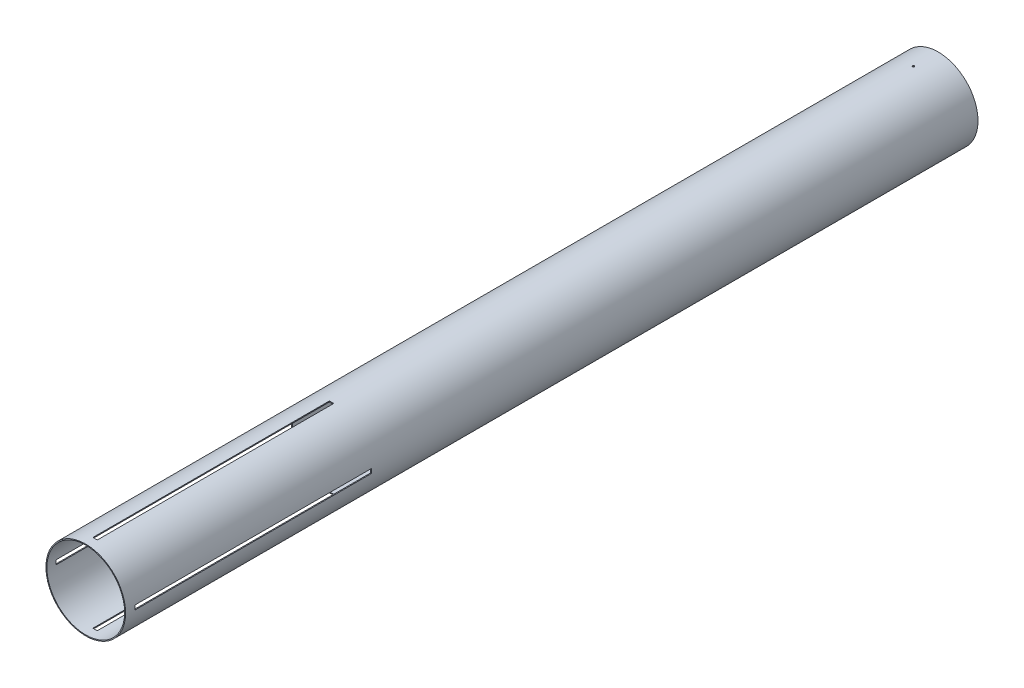
ISO-10303-21;
HEADER;
FILE_DESCRIPTION(('STEP AP214'),'2;1');
FILE_NAME('part.step','',(''),(''),'','','');
FILE_SCHEMA(('AUTOMOTIVE_DESIGN { 1 0 10303 214 1 1 1 1 }'));
ENDSEC;
DATA;
#1=APPLICATION_CONTEXT('core data for automotive mechanical design processes');
#2=APPLICATION_PROTOCOL_DEFINITION('international standard','automotive_design',2000,#1);
#3=PRODUCT_CONTEXT('',#1,'mechanical');
#4=PRODUCT('Part','Part','',(#3));
#5=PRODUCT_RELATED_PRODUCT_CATEGORY('part','',(#4));
#6=PRODUCT_DEFINITION_FORMATION('','',#4);
#7=PRODUCT_DEFINITION_CONTEXT('part definition',#1,'design');
#8=PRODUCT_DEFINITION('design','',#6,#7);
#9=PRODUCT_DEFINITION_SHAPE('','',#8);
#10=(LENGTH_UNIT() NAMED_UNIT(*) SI_UNIT(.MILLI.,.METRE.));
#11=(NAMED_UNIT(*) PLANE_ANGLE_UNIT() SI_UNIT($,.RADIAN.));
#12=(NAMED_UNIT(*) SI_UNIT($,.STERADIAN.) SOLID_ANGLE_UNIT());
#13=UNCERTAINTY_MEASURE_WITH_UNIT(LENGTH_MEASURE(1.E-05),#10,'distance_accuracy_value','');
#14=(GEOMETRIC_REPRESENTATION_CONTEXT(3) GLOBAL_UNCERTAINTY_ASSIGNED_CONTEXT((#13)) GLOBAL_UNIT_ASSIGNED_CONTEXT((#10,
#11,#12)) REPRESENTATION_CONTEXT('',''));
#15=CARTESIAN_POINT('',(0.,0.,0.));
#16=DIRECTION('',(0.,0.,1.));
#17=DIRECTION('',(1.,0.,0.));
#18=AXIS2_PLACEMENT_3D('',#15,#16,#17);
#19=CARTESIAN_POINT('',(0.,0.,685.));
#20=DIRECTION('',(0.,0.,-1.));
#21=DIRECTION('',(-1.,0.,0.));
#22=AXIS2_PLACEMENT_3D('',#19,#20,#21);
#23=CYLINDRICAL_SURFACE('',#22,64.);
#24=DIRECTION('',(0.,0.,-1.));
#25=VECTOR('',#24,1.);
#26=CARTESIAN_POINT('',(63.9042252124224,-3.49999999999978,685.));
#27=LINE('',#26,#25);
#28=CARTESIAN_POINT('',(63.9042252124224,-3.49999999999978,290.));
#29=VERTEX_POINT('',#28);
#30=CARTESIAN_POINT('',(63.9042252124224,-3.49999999999978,670.));
#31=VERTEX_POINT('',#30);
#32=EDGE_CURVE('E212',#29,#31,#27,.F.);
#33=ORIENTED_EDGE('',*,*,#32,.T.);
#34=CARTESIAN_POINT('',(0.,0.,670.));
#35=DIRECTION('',(0.,0.,1.));
#36=DIRECTION('',(1.,0.,0.));
#37=AXIS2_PLACEMENT_3D('',#34,#35,#36);
#38=CIRCLE('',#37,64.);
#39=CARTESIAN_POINT('',(63.9042252124224,3.50000000000022,670.));
#40=VERTEX_POINT('',#39);
#41=EDGE_CURVE('E202',#31,#40,#38,.T.);
#42=ORIENTED_EDGE('',*,*,#41,.T.);
#43=DIRECTION('',(0.,0.,-1.));
#44=VECTOR('',#43,1.);
#45=CARTESIAN_POINT('',(63.9042252124224,3.50000000000022,685.));
#46=LINE('',#45,#44);
#47=CARTESIAN_POINT('',(63.9042252124224,3.50000000000022,290.));
#48=VERTEX_POINT('',#47);
#49=EDGE_CURVE('E208',#40,#48,#46,.T.);
#50=ORIENTED_EDGE('',*,*,#49,.T.);
#51=CARTESIAN_POINT('',(0.,0.,290.));
#52=DIRECTION('',(0.,0.,-1.));
#53=DIRECTION('',(-1.,0.,0.));
#54=AXIS2_PLACEMENT_3D('',#51,#52,#53);
#55=CIRCLE('',#54,64.);
#56=EDGE_CURVE('E189',#48,#29,#55,.T.);
#57=ORIENTED_EDGE('',*,*,#56,.T.);
#58=EDGE_LOOP('',(#33,#42,#50,#57));
#59=FACE_BOUND('',#58,.T.);
#60=DIRECTION('',(0.,0.,-1.));
#61=VECTOR('',#60,1.);
#62=CARTESIAN_POINT('',(-63.9042252124224,3.49999999999978,685.));
#63=LINE('',#62,#61);
#64=CARTESIAN_POINT('',(-63.9042252124224,3.49999999999978,290.));
#65=VERTEX_POINT('',#64);
#66=CARTESIAN_POINT('',(-63.9042252124224,3.49999999999978,670.));
#67=VERTEX_POINT('',#66);
#68=EDGE_CURVE('E162',#65,#67,#63,.F.);
#69=ORIENTED_EDGE('',*,*,#68,.T.);
#70=CARTESIAN_POINT('',(-63.9042252124224,-3.50000000000022,670.));
#71=VERTEX_POINT('',#70);
#72=EDGE_CURVE('E172',#67,#71,#38,.T.);
#73=ORIENTED_EDGE('',*,*,#72,.T.);
#74=DIRECTION('',(0.,0.,-1.));
#75=VECTOR('',#74,1.);
#76=CARTESIAN_POINT('',(-63.9042252124224,-3.50000000000022,685.));
#77=LINE('',#76,#75);
#78=CARTESIAN_POINT('',(-63.9042252124224,-3.50000000000022,290.));
#79=VERTEX_POINT('',#78);
#80=EDGE_CURVE('E171',#71,#79,#77,.T.);
#81=ORIENTED_EDGE('',*,*,#80,.T.);
#82=EDGE_CURVE('E177',#79,#65,#55,.T.);
#83=ORIENTED_EDGE('',*,*,#82,.T.);
#84=EDGE_LOOP('',(#69,#73,#81,#83));
#85=FACE_BOUND('',#84,.T.);
#86=DIRECTION('',(0.,0.,-1.));
#87=VECTOR('',#86,1.);
#88=CARTESIAN_POINT('',(-3.5,-63.9042252124224,685.));
#89=LINE('',#88,#87);
#90=CARTESIAN_POINT('',(-3.5,-63.9042252124224,290.));
#91=VERTEX_POINT('',#90);
#92=CARTESIAN_POINT('',(-3.5,-63.9042252124224,670.));
#93=VERTEX_POINT('',#92);
#94=EDGE_CURVE('E248',#91,#93,#89,.F.);
#95=ORIENTED_EDGE('',*,*,#94,.T.);
#96=CARTESIAN_POINT('',(0.,0.,670.));
#97=DIRECTION('',(0.,0.,1.));
#98=DIRECTION('',(1.,0.,0.));
#99=AXIS2_PLACEMENT_3D('',#96,#97,#98);
#100=CIRCLE('',#99,64.);
#101=CARTESIAN_POINT('',(3.5,-63.9042252124224,670.));
#102=VERTEX_POINT('',#101);
#103=EDGE_CURVE('E256',#93,#102,#100,.T.);
#104=ORIENTED_EDGE('',*,*,#103,.T.);
#105=DIRECTION('',(0.,0.,-1.));
#106=VECTOR('',#105,1.);
#107=CARTESIAN_POINT('',(3.5,-63.9042252124224,685.));
#108=LINE('',#107,#106);
#109=CARTESIAN_POINT('',(3.5,-63.9042252124224,290.));
#110=VERTEX_POINT('',#109);
#111=EDGE_CURVE('E239',#102,#110,#108,.T.);
#112=ORIENTED_EDGE('',*,*,#111,.T.);
#113=CARTESIAN_POINT('',(0.,0.,290.));
#114=DIRECTION('',(0.,0.,-1.));
#115=DIRECTION('',(-1.,0.,0.));
#116=AXIS2_PLACEMENT_3D('',#113,#114,#115);
#117=CIRCLE('',#116,64.);
#118=EDGE_CURVE('E243',#110,#91,#117,.T.);
#119=ORIENTED_EDGE('',*,*,#118,.T.);
#120=EDGE_LOOP('',(#95,#104,#112,#119));
#121=FACE_BOUND('',#120,.T.);
#122=DIRECTION('',(0.,0.,-1.));
#123=VECTOR('',#122,1.);
#124=CARTESIAN_POINT('',(3.5,63.9042252124224,685.));
#125=LINE('',#124,#123);
#126=CARTESIAN_POINT('',(3.5,63.9042252124224,290.));
#127=VERTEX_POINT('',#126);
#128=CARTESIAN_POINT('',(3.5,63.9042252124224,670.));
#129=VERTEX_POINT('',#128);
#130=EDGE_CURVE('E235',#127,#129,#125,.F.);
#131=ORIENTED_EDGE('',*,*,#130,.T.);
#132=CARTESIAN_POINT('',(-3.5,63.9042252124224,670.));
#133=VERTEX_POINT('',#132);
#134=EDGE_CURVE('E260',#129,#133,#100,.T.);
#135=ORIENTED_EDGE('',*,*,#134,.T.);
#136=DIRECTION('',(0.,0.,-1.));
#137=VECTOR('',#136,1.);
#138=CARTESIAN_POINT('',(-3.5,63.9042252124224,685.));
#139=LINE('',#138,#137);
#140=CARTESIAN_POINT('',(-3.5,63.9042252124224,290.));
#141=VERTEX_POINT('',#140);
#142=EDGE_CURVE('E252',#133,#141,#139,.T.);
#143=ORIENTED_EDGE('',*,*,#142,.T.);
#144=EDGE_CURVE('E247',#141,#127,#117,.T.);
#145=ORIENTED_EDGE('',*,*,#144,.T.);
#146=EDGE_LOOP('',(#131,#135,#143,#145));
#147=FACE_BOUND('',#146,.T.);
#148=CARTESIAN_POINT('',(0.,0.,685.));
#149=DIRECTION('',(0.,0.,1.));
#150=DIRECTION('',(1.,0.,0.));
#151=AXIS2_PLACEMENT_3D('',#148,#149,#150);
#152=CIRCLE('',#151,64.);
#153=CARTESIAN_POINT('',(64.,0.,685.));
#154=VERTEX_POINT('',#153);
#155=EDGE_CURVE('E270',#154,#154,#152,.T.);
#156=ORIENTED_EDGE('',*,*,#155,.F.);
#157=EDGE_LOOP('',(#156));
#158=FACE_BOUND('',#157,.T.);
#159=CARTESIAN_POINT('',(0.,0.,-685.));
#160=DIRECTION('',(0.,0.,1.));
#161=DIRECTION('',(1.,0.,0.));
#162=AXIS2_PLACEMENT_3D('',#159,#160,#161);
#163=CIRCLE('',#162,64.);
#164=CARTESIAN_POINT('',(64.,0.,-685.));
#165=VERTEX_POINT('',#164);
#166=EDGE_CURVE('E265',#165,#165,#163,.T.);
#167=ORIENTED_EDGE('',*,*,#166,.T.);
#168=EDGE_LOOP('',(#167));
#169=FACE_BOUND('',#168,.T.);
#170=CARTESIAN_POINT('',(0.,64.,-646.5));
#171=CARTESIAN_POINT('',(-0.0842432464168796,63.9999997628226,-646.499996267968));
#172=CARTESIAN_POINT('',(-0.168547282625958,63.9998318808151,-646.492879257045));
#173=CARTESIAN_POINT('',(-0.334832726654814,63.9991783052621,-646.464587326837));
#174=CARTESIAN_POINT('',(-0.416811228955495,63.9986922309657,-646.443395565176));
#175=CARTESIAN_POINT('',(-0.576012537903443,63.9974573242793,-646.387558509466));
#176=CARTESIAN_POINT('',(-0.653237628624948,63.9967086192637,-646.352919736276));
#177=CARTESIAN_POINT('',(-0.800755036477905,63.9950329320025,-646.27118112491));
#178=CARTESIAN_POINT('',(-0.871049052436263,63.9941059936076,-646.224084350701));
#179=CARTESIAN_POINT('',(-1.00275419936758,63.9921778862607,-646.118747562573));
#180=CARTESIAN_POINT('',(-1.06416287208625,63.9911766968816,-646.060504475182));
#181=CARTESIAN_POINT('',(-1.17633367680142,63.989213110401,-645.934533172193));
#182=CARTESIAN_POINT('',(-1.22709538710171,63.9882507148373,-645.866804581077));
#183=CARTESIAN_POINT('',(-1.31653312424949,63.9864731723341,-645.723778329776));
#184=CARTESIAN_POINT('',(-1.35520798435571,63.9856580396131,-645.648479939808));
#185=CARTESIAN_POINT('',(-1.4193664600848,63.984267086021,-645.492456803512));
#186=CARTESIAN_POINT('',(-1.44485011832756,63.9836912643767,-645.411732074719));
#187=CARTESIAN_POINT('',(-1.48189836496801,63.9828439833754,-645.247163452485));
#188=CARTESIAN_POINT('',(-1.49346551789751,63.9825724679416,-645.163320136675));
#189=CARTESIAN_POINT('',(-1.50236029302677,63.9823642441199,-644.994881350676));
#190=CARTESIAN_POINT('',(-1.49968795991505,63.9824275346813,-644.91028588285));
#191=CARTESIAN_POINT('',(-1.4801818227288,63.982881733414,-644.742761557349));
#192=CARTESIAN_POINT('',(-1.463350799315,63.9832725772563,-644.659832375702));
#193=CARTESIAN_POINT('',(-1.4160093477606,63.9843377198551,-644.497976943138));
#194=CARTESIAN_POINT('',(-1.38549889560542,63.9850120191092,-644.419050699248));
#195=CARTESIAN_POINT('',(-1.31166148151313,63.9865681301519,-644.267432684879));
#196=CARTESIAN_POINT('',(-1.26833324418769,63.9874499625887,-644.194741535728));
#197=CARTESIAN_POINT('',(-1.17009116000284,63.9893217048985,-644.057663996139));
#198=CARTESIAN_POINT('',(-1.11517729880978,63.9903116149053,-643.993277615975));
#199=CARTESIAN_POINT('',(-0.995307029405623,63.9922882020089,-643.874621096383));
#200=CARTESIAN_POINT('',(-0.930348207208107,63.9932748782703,-643.820353395591));
#201=CARTESIAN_POINT('',(-0.792240497696129,63.9951335349813,-643.723493483422));
#202=CARTESIAN_POINT('',(-0.719091609165252,63.9960055154139,-643.68090127378));
#203=CARTESIAN_POINT('',(-0.566678885229389,63.9975364866561,-643.608601680337));
#204=CARTESIAN_POINT('',(-0.487415014414908,63.9981954762322,-643.578894371153));
#205=CARTESIAN_POINT('',(-0.325022969835765,63.9992261560904,-643.533209418498));
#206=CARTESIAN_POINT('',(-0.24189480255858,63.999597846855,-643.517231751977));
#207=CARTESIAN_POINT('',(-0.0741550866035679,64.0000119668816,-643.499462620374));
#208=CARTESIAN_POINT('',(0.0104561044938451,64.0000544744495,-643.497667781492));
#209=CARTESIAN_POINT('',(0.178778644150466,63.9998056434817,-643.508306465462));
#210=CARTESIAN_POINT('',(0.262489993329967,63.9995143051762,-643.520739978505));
#211=CARTESIAN_POINT('',(0.426627165825105,63.9986306717734,-643.55947962889));
#212=CARTESIAN_POINT('',(0.50705335038287,63.9980384098629,-643.585784236495));
#213=CARTESIAN_POINT('',(0.662348240924991,63.9966196814805,-643.651517821593));
#214=CARTESIAN_POINT('',(0.737216940366766,63.9957932147328,-643.690946814535));
#215=CARTESIAN_POINT('',(0.879287126186259,63.993999013421,-643.781818609278));
#216=CARTESIAN_POINT('',(0.946487159025408,63.9930312521545,-643.833263683025));
#217=CARTESIAN_POINT('',(1.07129784425556,63.9910636334422,-643.94670395673));
#218=CARTESIAN_POINT('',(1.12890848019408,63.9900637759412,-644.008699174789));
#219=CARTESIAN_POINT('',(1.23291623810238,63.9881444628188,-644.141494348764));
#220=CARTESIAN_POINT('',(1.27931118307005,63.9872250228287,-644.212296010007));
#221=CARTESIAN_POINT('',(1.35955566277255,63.9855704525309,-644.360685500305));
#222=CARTESIAN_POINT('',(1.39340521993241,63.9848353218936,-644.438273317229));
#223=CARTESIAN_POINT('',(1.44759425584247,63.9836323643983,-644.598024457638));
#224=CARTESIAN_POINT('',(1.46793514880401,63.98316450956,-644.680187301189));
#225=CARTESIAN_POINT('',(1.49453409561047,63.9825487732836,-644.84676304402));
#226=CARTESIAN_POINT('',(1.50079214711294,63.9824008918987,-644.931175943674));
#227=CARTESIAN_POINT('',(1.49904758236694,63.982441786071,-645.099833697408));
#228=CARTESIAN_POINT('',(1.49104840855744,63.9826304803614,-645.184078587138));
#229=CARTESIAN_POINT('',(1.4610235184294,63.9833230828703,-645.350029396229));
#230=CARTESIAN_POINT('',(1.43899777413215,63.9838269917176,-645.431735310525));
#231=CARTESIAN_POINT('',(1.38154524329808,63.9850932080193,-645.590290661175));
#232=CARTESIAN_POINT('',(1.34611821906928,63.9858555200567,-645.667140011362));
#233=CARTESIAN_POINT('',(1.26287055247259,63.9875525677277,-645.81379806634));
#234=CARTESIAN_POINT('',(1.21505037325752,63.9884872969175,-645.883607034107));
#235=CARTESIAN_POINT('',(1.1083659675787,63.9904239990653,-646.014217116695));
#236=CARTESIAN_POINT('',(1.04950025062323,63.9914259810868,-646.075017013842));
#237=CARTESIAN_POINT('',(0.922379849025401,63.9933844022882,-646.185887422987));
#238=CARTESIAN_POINT('',(0.854122839770082,63.994340830113,-646.235955270624));
#239=CARTESIAN_POINT('',(0.710136520114992,63.9961005811615,-646.323945637837));
#240=CARTESIAN_POINT('',(0.634402888218841,63.9969038150434,-646.36186107891));
#241=CARTESIAN_POINT('',(0.477701927426392,63.9982649333952,-646.424394994684));
#242=CARTESIAN_POINT('',(0.396740982855364,63.9988231108956,-646.449029358544));
#243=CARTESIAN_POINT('',(0.262722364036418,63.9994817040198,-646.477758974918));
#244=CARTESIAN_POINT('',(0.210534949297634,63.9996752240504,-646.486088898233));
#245=CARTESIAN_POINT('',(0.105572982386119,63.9999344463531,-646.497210579783));
#246=CARTESIAN_POINT('',(0.0527984303179872,64.0000001486481,-646.500002339005));
#247=CARTESIAN_POINT('',(0.,64.,-646.5));
#248=B_SPLINE_CURVE_WITH_KNOTS('',3,(#170,#171,#172,#173,#174,#175,#176,#177,#178,#179,#180,
#181,#182,#183,#184,#185,#186,#187,#188,#189,#190,#191,#192,#193,#194,#195,#196,#197,#198,#199,
#200,#201,#202,#203,#204,#205,#206,#207,#208,#209,#210,#211,#212,#213,#214,#215,#216,#217,#218,
#219,#220,#221,#222,#223,#224,#225,#226,#227,#228,#229,#230,#231,#232,#233,#234,#235,#236,#237,
#238,#239,#240,#241,#242,#243,#244,#245,#246,#247),.UNSPECIFIED.,.T.,.F.,(4,2,2,2,2,2,2,2,2,2,2,
2,2,2,2,2,2,2,2,2,2,2,2,2,2,2,2,2,2,2,2,2,2,2,2,2,2,2,4),(0.,0.252537020858155,
0.505376782801468,0.758094088035439,1.01074929672776,1.26347427290081,1.51620925690893,
1.76896862984507,2.02172718612749,2.2744391569578,2.5271503346896,2.77981189342262,
3.03247389571142,3.28516104669898,3.53784851031129,3.79059679395122,4.04334511513023,
4.2960948999868,4.54884426053609,4.80153349546075,5.05422255618659,5.30688375559085,
5.55954525243725,5.8122545601213,6.0649643013727,6.31772305509244,6.5704813570008,
6.82321319367001,7.07594507237681,7.32861593667213,7.58128730496991,7.83396315498721,
8.08662956344909,8.33933009142399,8.59209328290501,8.84500343682506,9.09761033989657,
9.25588487513776,9.41415938218264),.UNSPECIFIED.);
#249=CARTESIAN_POINT('',(0.,64.,-646.5));
#250=VERTEX_POINT('',#249);
#251=EDGE_CURVE('E335',#250,#250,#248,.T.);
#252=ORIENTED_EDGE('',*,*,#251,.F.);
#253=EDGE_LOOP('',(#252));
#254=FACE_BOUND('',#253,.T.);
#255=ADVANCED_FACE('F45',(#59,#85,#121,#147,#158,#169,#254),#23,.T.);
#256=CARTESIAN_POINT('',(0.,0.,685.));
#257=DIRECTION('',(0.,0.,-1.));
#258=DIRECTION('',(-1.,0.,0.));
#259=AXIS2_PLACEMENT_3D('',#256,#257,#258);
#260=CYLINDRICAL_SURFACE('',#259,62.5);
#261=CARTESIAN_POINT('',(0.,0.,-685.));
#262=DIRECTION('',(0.,0.,1.));
#263=DIRECTION('',(1.,0.,0.));
#264=AXIS2_PLACEMENT_3D('',#261,#262,#263);
#265=CIRCLE('',#264,62.5);
#266=CARTESIAN_POINT('',(62.5,0.,-685.));
#267=VERTEX_POINT('',#266);
#268=EDGE_CURVE('E266',#267,#267,#265,.T.);
#269=ORIENTED_EDGE('',*,*,#268,.F.);
#270=EDGE_LOOP('',(#269));
#271=FACE_BOUND('',#270,.T.);
#272=CARTESIAN_POINT('',(0.,0.,685.));
#273=DIRECTION('',(0.,0.,1.));
#274=DIRECTION('',(1.,0.,0.));
#275=AXIS2_PLACEMENT_3D('',#272,#273,#274);
#276=CIRCLE('',#275,62.5);
#277=CARTESIAN_POINT('',(62.5,0.,685.));
#278=VERTEX_POINT('',#277);
#279=EDGE_CURVE('E261',#278,#278,#276,.T.);
#280=ORIENTED_EDGE('',*,*,#279,.T.);
#281=EDGE_LOOP('',(#280));
#282=FACE_BOUND('',#281,.T.);
#283=CARTESIAN_POINT('',(0.,0.,670.));
#284=DIRECTION('',(0.,0.,1.));
#285=DIRECTION('',(1.,0.,0.));
#286=AXIS2_PLACEMENT_3D('',#283,#284,#285);
#287=CIRCLE('',#286,62.5);
#288=CARTESIAN_POINT('',(3.5,62.4019230472908,670.));
#289=VERTEX_POINT('',#288);
#290=CARTESIAN_POINT('',(-3.5,62.4019230472908,670.));
#291=VERTEX_POINT('',#290);
#292=EDGE_CURVE('E288',#289,#291,#287,.T.);
#293=ORIENTED_EDGE('',*,*,#292,.F.);
#294=DIRECTION('',(0.,0.,-1.));
#295=VECTOR('',#294,1.);
#296=CARTESIAN_POINT('',(3.5,62.4019230472908,685.));
#297=LINE('',#296,#295);
#298=CARTESIAN_POINT('',(3.5,62.4019230472908,290.));
#299=VERTEX_POINT('',#298);
#300=EDGE_CURVE('E274',#299,#289,#297,.F.);
#301=ORIENTED_EDGE('',*,*,#300,.F.);
#302=CARTESIAN_POINT('',(0.,0.,290.));
#303=DIRECTION('',(0.,0.,-1.));
#304=DIRECTION('',(-1.,0.,0.));
#305=AXIS2_PLACEMENT_3D('',#302,#303,#304);
#306=CIRCLE('',#305,62.5);
#307=CARTESIAN_POINT('',(-3.5,62.4019230472908,290.));
#308=VERTEX_POINT('',#307);
#309=EDGE_CURVE('E280',#308,#299,#306,.T.);
#310=ORIENTED_EDGE('',*,*,#309,.F.);
#311=DIRECTION('',(0.,0.,-1.));
#312=VECTOR('',#311,1.);
#313=CARTESIAN_POINT('',(-3.5,62.4019230472908,685.));
#314=LINE('',#313,#312);
#315=EDGE_CURVE('E284',#291,#308,#314,.T.);
#316=ORIENTED_EDGE('',*,*,#315,.F.);
#317=EDGE_LOOP('',(#293,#301,#310,#316));
#318=FACE_BOUND('',#317,.T.);
#319=CARTESIAN_POINT('',(-3.5,-62.4019230472908,670.));
#320=VERTEX_POINT('',#319);
#321=CARTESIAN_POINT('',(3.5,-62.4019230472908,670.));
#322=VERTEX_POINT('',#321);
#323=EDGE_CURVE('E292',#320,#322,#287,.T.);
#324=ORIENTED_EDGE('',*,*,#323,.F.);
#325=DIRECTION('',(0.,0.,-1.));
#326=VECTOR('',#325,1.);
#327=CARTESIAN_POINT('',(-3.5,-62.4019230472908,685.));
#328=LINE('',#327,#326);
#329=CARTESIAN_POINT('',(-3.5,-62.4019230472908,290.));
#330=VERTEX_POINT('',#329);
#331=EDGE_CURVE('E295',#330,#320,#328,.F.);
#332=ORIENTED_EDGE('',*,*,#331,.F.);
#333=CARTESIAN_POINT('',(3.5,-62.4019230472908,290.));
#334=VERTEX_POINT('',#333);
#335=EDGE_CURVE('E285',#334,#330,#306,.T.);
#336=ORIENTED_EDGE('',*,*,#335,.F.);
#337=DIRECTION('',(0.,0.,-1.));
#338=VECTOR('',#337,1.);
#339=CARTESIAN_POINT('',(3.5,-62.4019230472908,685.));
#340=LINE('',#339,#338);
#341=EDGE_CURVE('E291',#322,#334,#340,.T.);
#342=ORIENTED_EDGE('',*,*,#341,.F.);
#343=EDGE_LOOP('',(#324,#332,#336,#342));
#344=FACE_BOUND('',#343,.T.);
#345=CARTESIAN_POINT('',(0.,0.,670.));
#346=DIRECTION('',(0.,0.,1.));
#347=DIRECTION('',(1.,0.,0.));
#348=AXIS2_PLACEMENT_3D('',#345,#346,#347);
#349=CIRCLE('',#348,62.5);
#350=CARTESIAN_POINT('',(-62.4019230472908,3.49999999999978,670.));
#351=VERTEX_POINT('',#350);
#352=CARTESIAN_POINT('',(-62.4019230472908,-3.50000000000022,670.));
#353=VERTEX_POINT('',#352);
#354=EDGE_CURVE('E201',#351,#353,#349,.T.);
#355=ORIENTED_EDGE('',*,*,#354,.F.);
#356=DIRECTION('',(0.,0.,-1.));
#357=VECTOR('',#356,1.);
#358=CARTESIAN_POINT('',(-62.4019230472908,3.49999999999978,685.));
#359=LINE('',#358,#357);
#360=CARTESIAN_POINT('',(-62.4019230472908,3.49999999999978,290.));
#361=VERTEX_POINT('',#360);
#362=EDGE_CURVE('E298',#361,#351,#359,.F.);
#363=ORIENTED_EDGE('',*,*,#362,.F.);
#364=CARTESIAN_POINT('',(0.,0.,290.));
#365=DIRECTION('',(0.,0.,-1.));
#366=DIRECTION('',(-1.,0.,0.));
#367=AXIS2_PLACEMENT_3D('',#364,#365,#366);
#368=CIRCLE('',#367,62.5);
#369=CARTESIAN_POINT('',(-62.4019230472908,-3.50000000000022,290.));
#370=VERTEX_POINT('',#369);
#371=EDGE_CURVE('E180',#370,#361,#368,.T.);
#372=ORIENTED_EDGE('',*,*,#371,.F.);
#373=DIRECTION('',(0.,0.,-1.));
#374=VECTOR('',#373,1.);
#375=CARTESIAN_POINT('',(-62.4019230472908,-3.50000000000022,685.));
#376=LINE('',#375,#374);
#377=EDGE_CURVE('E301',#353,#370,#376,.T.);
#378=ORIENTED_EDGE('',*,*,#377,.F.);
#379=EDGE_LOOP('',(#355,#363,#372,#378));
#380=FACE_BOUND('',#379,.T.);
#381=CARTESIAN_POINT('',(62.4019230472908,-3.49999999999978,670.));
#382=VERTEX_POINT('',#381);
#383=CARTESIAN_POINT('',(62.4019230472908,3.50000000000022,670.));
#384=VERTEX_POINT('',#383);
#385=EDGE_CURVE('E195',#382,#384,#349,.T.);
#386=ORIENTED_EDGE('',*,*,#385,.F.);
#387=DIRECTION('',(0.,0.,-1.));
#388=VECTOR('',#387,1.);
#389=CARTESIAN_POINT('',(62.4019230472908,-3.49999999999978,685.));
#390=LINE('',#389,#388);
#391=CARTESIAN_POINT('',(62.4019230472908,-3.49999999999978,290.));
#392=VERTEX_POINT('',#391);
#393=EDGE_CURVE('E11',#392,#382,#390,.F.);
#394=ORIENTED_EDGE('',*,*,#393,.F.);
#395=CARTESIAN_POINT('',(62.4019230472908,3.50000000000022,290.));
#396=VERTEX_POINT('',#395);
#397=EDGE_CURVE('E190',#396,#392,#368,.T.);
#398=ORIENTED_EDGE('',*,*,#397,.F.);
#399=DIRECTION('',(0.,0.,-1.));
#400=VECTOR('',#399,1.);
#401=CARTESIAN_POINT('',(62.4019230472908,3.50000000000022,685.));
#402=LINE('',#401,#400);
#403=EDGE_CURVE('E60',#384,#396,#402,.T.);
#404=ORIENTED_EDGE('',*,*,#403,.F.);
#405=EDGE_LOOP('',(#386,#394,#398,#404));
#406=FACE_BOUND('',#405,.T.);
#407=CARTESIAN_POINT('',(0.,62.5,-646.5));
#408=CARTESIAN_POINT('',(-0.0842426436236575,62.4999997571578,-646.499996268177));
#409=CARTESIAN_POINT('',(-0.168546062295655,62.4998278484682,-646.492879358704));
#410=CARTESIAN_POINT('',(-0.334830246920786,62.4991585967848,-646.464587854949));
#411=CARTESIAN_POINT('',(-0.416808108012133,62.498660863996,-646.44339642237));
#412=CARTESIAN_POINT('',(-0.576008131308593,62.4973963374838,-646.387560292191));
#413=CARTESIAN_POINT('',(-0.653232579187591,62.4966296742822,-646.352922119922));
#414=CARTESIAN_POINT('',(-0.800748828798,62.494913791912,-646.271184978708));
#415=CARTESIAN_POINT('',(-0.871042328397337,62.493964617622,-646.224089071985));
#416=CARTESIAN_POINT('',(-1.00274722366933,62.4919902441921,-646.118753798316));
#417=CARTESIAN_POINT('',(-1.06415608702201,62.4909650235028,-646.060511265275));
#418=CARTESIAN_POINT('',(-1.17632741146933,62.4889542983729,-645.934541038052));
#419=CARTESIAN_POINT('',(-1.22708945069738,62.4879687955074,-645.866812968195));
#420=CARTESIAN_POINT('',(-1.31652824496818,62.4861485609272,-645.723787238759));
#421=CARTESIAN_POINT('',(-1.35520376557928,62.4853138446165,-645.648488807035));
#422=CARTESIAN_POINT('',(-1.41936351191109,62.4838894673628,-645.492465364999));
#423=CARTESIAN_POINT('',(-1.4448477810347,62.4832998056135,-645.411740372543));
#424=CARTESIAN_POINT('',(-1.48189695877363,62.4824321580996,-645.247171782658));
#425=CARTESIAN_POINT('',(-1.49346455773845,62.4821541120945,-645.163328791229));
#426=CARTESIAN_POINT('',(-1.50236031000208,62.4819408647153,-644.994890555969));
#427=CARTESIAN_POINT('',(-1.49968850891384,62.482005662243,-644.910295314549));
#428=CARTESIAN_POINT('',(-1.48018360977221,62.4824707386811,-644.742772189753));
#429=CARTESIAN_POINT('',(-1.46335342778283,62.48287094851,-644.659843966638));
#430=CARTESIAN_POINT('',(-1.41601401901455,62.4839616236419,-644.497990309574));
#431=CARTESIAN_POINT('',(-1.38550476775728,62.4846520894644,-644.419064882788));
#432=CARTESIAN_POINT('',(-1.31166992540781,62.486245517431,-644.267447898154));
#433=CARTESIAN_POINT('',(-1.26834299686774,62.4871485017481,-644.194756991863));
#434=CARTESIAN_POINT('',(-1.17010370775825,62.4890651457928,-644.057679656296));
#435=CARTESIAN_POINT('',(-1.11519133193174,62.4900788056661,-643.993293237958));
#436=CARTESIAN_POINT('',(-0.995323403170472,62.4921028345533,-643.874635573418));
#437=CARTESIAN_POINT('',(-0.930365319010048,62.493113202672,-643.82036688421));
#438=CARTESIAN_POINT('',(-0.79225884701449,62.4950164976566,-643.723504865347));
#439=CARTESIAN_POINT('',(-0.719110457954927,62.495909424505,-643.680911537436));
#440=CARTESIAN_POINT('',(-0.566698412554812,62.4974771827409,-643.608609621378));
#441=CARTESIAN_POINT('',(-0.487434719002333,62.4981520128012,-643.578901111641));
#442=CARTESIAN_POINT('',(-0.325042732064251,62.499207480879,-643.533213781311));
#443=CARTESIAN_POINT('',(-0.241914445473408,62.4995881194138,-643.517234936578));
#444=CARTESIAN_POINT('',(-0.0741752248471671,62.5000122292339,-643.499463650431));
#445=CARTESIAN_POINT('',(0.0104353341901548,62.5000557845974,-643.497667671408));
#446=CARTESIAN_POINT('',(0.178756798388446,62.4998010406687,-643.50830388234));
#447=CARTESIAN_POINT('',(0.262467704201697,62.4995027416243,-643.520736061979));
#448=CARTESIAN_POINT('',(0.426603735465597,62.4985979661473,-643.559472755227));
#449=CARTESIAN_POINT('',(0.507029239723104,62.4979915253524,-643.585775664649));
#450=CARTESIAN_POINT('',(0.662323075494102,62.4965388156371,-643.651505536252));
#451=CARTESIAN_POINT('',(0.737191400113436,62.4956925464193,-643.690932514713));
#452=CARTESIAN_POINT('',(0.879261907617199,62.4938553314222,-643.781800442767));
#453=CARTESIAN_POINT('',(0.946462566495539,62.4928643569705,-643.833243774531));
#454=CARTESIAN_POINT('',(1.07127484997173,62.4908495249712,-643.946680614552));
#455=CARTESIAN_POINT('',(1.12888645750571,62.4898256673651,-644.008674141582));
#456=CARTESIAN_POINT('',(1.23289702617828,62.4878602560818,-644.141466735002));
#457=CARTESIAN_POINT('',(1.27929370466522,62.4869187191848,-644.212267589574));
#458=CARTESIAN_POINT('',(1.35954174937375,62.4852243666037,-644.360655872007));
#459=CARTESIAN_POINT('',(1.39339313846485,62.4844715505754,-644.438243287495));
#460=CARTESIAN_POINT('',(1.44758569815912,62.4832396361496,-644.597993645178));
#461=CARTESIAN_POINT('',(1.46792835112662,62.48276050772,-644.680156084265));
#462=CARTESIAN_POINT('',(1.49453085092912,62.4821299034959,-644.846731375048));
#463=CARTESIAN_POINT('',(1.50079069654217,62.4819784277298,-644.93114422694));
#464=CARTESIAN_POINT('',(1.49904969609286,62.4820202183555,-645.099801195361));
#465=CARTESIAN_POINT('',(1.49105245847581,62.4822133975157,-645.184045349185));
#466=CARTESIAN_POINT('',(1.46103170461056,62.4829225368854,-645.349994999529));
#467=CARTESIAN_POINT('',(1.43900816039659,62.4834384977386,-645.431700490987));
#468=CARTESIAN_POINT('',(1.38156026885266,62.4847350255058,-645.590255347553));
#469=CARTESIAN_POINT('',(1.34613568471874,62.4855155970956,-645.667104626821));
#470=CARTESIAN_POINT('',(1.26289308052023,62.4872533124344,-645.813762991224));
#471=CARTESIAN_POINT('',(1.21507552246237,62.4882104496008,-645.883572338671));
#472=CARTESIAN_POINT('',(1.10839580714606,62.4901936087732,-646.014184489996));
#473=CARTESIAN_POINT('',(1.04953203091813,62.4912196408626,-646.074985971313));
#474=CARTESIAN_POINT('',(0.922415221172124,62.4932250873948,-646.185859895799));
#475=CARTESIAN_POINT('',(0.854159863227999,62.4942044902158,-646.23592967499));
#476=CARTESIAN_POINT('',(0.710176069582477,62.4960065388372,-646.323924441071));
#477=CARTESIAN_POINT('',(0.634443274433086,62.4968290923635,-646.361842287872));
#478=CARTESIAN_POINT('',(0.477743446323577,62.49822297275,-646.424381092761));
#479=CARTESIAN_POINT('',(0.396782797311056,62.4987945996127,-646.449017937412));
#480=CARTESIAN_POINT('',(0.262757570205557,62.4994691223223,-646.477752969788));
#481=CARTESIAN_POINT('',(0.210563266538616,62.4996673398909,-646.486085139662));
#482=CARTESIAN_POINT('',(0.105587268261363,62.4999328548275,-646.497209823855));
#483=CARTESIAN_POINT('',(0.0528055737608564,62.5000001522201,-646.500002339208));
#484=CARTESIAN_POINT('',(0.,62.5,-646.5));
#485=B_SPLINE_CURVE_WITH_KNOTS('',3,(#407,#408,#409,#410,#411,#412,#413,#414,#415,#416,#417,
#418,#419,#420,#421,#422,#423,#424,#425,#426,#427,#428,#429,#430,#431,#432,#433,#434,#435,#436,
#437,#438,#439,#440,#441,#442,#443,#444,#445,#446,#447,#448,#449,#450,#451,#452,#453,#454,#455,
#456,#457,#458,#459,#460,#461,#462,#463,#464,#465,#466,#467,#468,#469,#470,#471,#472,#473,#474,
#475,#476,#477,#478,#479,#480,#481,#482,#483,#484),.UNSPECIFIED.,.T.,.F.,(4,2,2,2,2,2,2,2,2,2,2,
2,2,2,2,2,2,2,2,2,2,2,2,2,2,2,2,2,2,2,2,2,2,2,2,2,2,2,4),(0.,0.252535186195922,
0.505373042702444,0.758088357024882,1.01074160929849,1.26346673212974,1.51620186697529,
1.76896280597314,2.02172291331182,2.27443414959559,2.52714457637207,2.77980296757903,
3.03246181091416,3.28514702699112,3.53783257583628,3.79058189812401,4.04333125819713,
4.29608215638375,4.54883261019834,4.8015200188968,5.05420724437494,5.30686525230108,
5.55952357366581,5.81223202561157,6.06494092725121,6.31770122124251,6.57046105446083,
6.82319314680859,7.07592526108565,7.3285934183434,7.5812620793744,7.83393520541222,
8.0865989132187,8.33929968119852,8.59206310575583,8.844974774917,9.09758323927538,
9.25587917255901,9.41417507625185),.UNSPECIFIED.);
#486=CARTESIAN_POINT('',(0.,62.5,-646.5));
#487=VERTEX_POINT('',#486);
#488=EDGE_CURVE('E49',#487,#487,#485,.T.);
#489=ORIENTED_EDGE('',*,*,#488,.T.);
#490=EDGE_LOOP('',(#489));
#491=FACE_BOUND('',#490,.T.);
#492=ADVANCED_FACE('F316',(#271,#282,#318,#344,#380,#406,#491),#260,.F.);
#493=CARTESIAN_POINT('',(0.,0.,685.));
#494=DIRECTION('',(0.,0.,1.));
#495=DIRECTION('',(1.,0.,0.));
#496=AXIS2_PLACEMENT_3D('',#493,#494,#495);
#497=PLANE('',#496);
#498=ORIENTED_EDGE('',*,*,#155,.T.);
#499=EDGE_LOOP('',(#498));
#500=FACE_BOUND('',#499,.T.);
#501=ORIENTED_EDGE('',*,*,#279,.F.);
#502=EDGE_LOOP('',(#501));
#503=FACE_BOUND('',#502,.T.);
#504=ADVANCED_FACE('F386',(#500,#503),#497,.T.);
#505=CARTESIAN_POINT('',(0.,0.,-685.));
#506=DIRECTION('',(0.,0.,1.));
#507=DIRECTION('',(1.,0.,0.));
#508=AXIS2_PLACEMENT_3D('',#505,#506,#507);
#509=PLANE('',#508);
#510=ORIENTED_EDGE('',*,*,#166,.F.);
#511=EDGE_LOOP('',(#510));
#512=FACE_BOUND('',#511,.T.);
#513=ORIENTED_EDGE('',*,*,#268,.T.);
#514=EDGE_LOOP('',(#513));
#515=FACE_BOUND('',#514,.T.);
#516=ADVANCED_FACE('F389',(#512,#515),#509,.F.);
#517=CARTESIAN_POINT('',(3.5,-75.,670.));
#518=DIRECTION('',(1.,0.,0.));
#519=DIRECTION('',(0.,0.,-1.));
#520=AXIS2_PLACEMENT_3D('',#517,#518,#519);
#521=PLANE('',#520);
#522=DIRECTION('',(0.,1.,0.));
#523=VECTOR('',#522,1.);
#524=CARTESIAN_POINT('',(3.5,-75.,290.));
#525=LINE('',#524,#523);
#526=EDGE_CURVE('E228',#299,#127,#525,.T.);
#527=ORIENTED_EDGE('',*,*,#526,.F.);
#528=ORIENTED_EDGE('',*,*,#300,.T.);
#529=DIRECTION('',(0.,1.,0.));
#530=VECTOR('',#529,1.);
#531=CARTESIAN_POINT('',(3.5,-75.,670.));
#532=LINE('',#531,#530);
#533=EDGE_CURVE('E216',#289,#129,#532,.T.);
#534=ORIENTED_EDGE('',*,*,#533,.T.);
#535=ORIENTED_EDGE('',*,*,#130,.F.);
#536=EDGE_LOOP('',(#527,#528,#534,#535));
#537=FACE_BOUND('',#536,.T.);
#538=ADVANCED_FACE('F373',(#537),#521,.F.);
#539=CARTESIAN_POINT('',(3.5,-75.,290.));
#540=DIRECTION('',(0.,0.,-1.));
#541=DIRECTION('',(-1.,0.,0.));
#542=AXIS2_PLACEMENT_3D('',#539,#540,#541);
#543=PLANE('',#542);
#544=DIRECTION('',(0.,1.,0.));
#545=VECTOR('',#544,1.);
#546=CARTESIAN_POINT('',(-3.5,-75.,290.));
#547=LINE('',#546,#545);
#548=EDGE_CURVE('E223',#308,#141,#547,.T.);
#549=ORIENTED_EDGE('',*,*,#548,.F.);
#550=ORIENTED_EDGE('',*,*,#309,.T.);
#551=ORIENTED_EDGE('',*,*,#526,.T.);
#552=ORIENTED_EDGE('',*,*,#144,.F.);
#553=EDGE_LOOP('',(#549,#550,#551,#552));
#554=FACE_BOUND('',#553,.T.);
#555=ADVANCED_FACE('F368',(#554),#543,.F.);
#556=CARTESIAN_POINT('',(-3.5,-75.,290.));
#557=DIRECTION('',(-1.,0.,0.));
#558=DIRECTION('',(0.,0.,1.));
#559=AXIS2_PLACEMENT_3D('',#556,#557,#558);
#560=PLANE('',#559);
#561=DIRECTION('',(0.,1.,0.));
#562=VECTOR('',#561,1.);
#563=CARTESIAN_POINT('',(-3.5,-75.,670.));
#564=LINE('',#563,#562);
#565=EDGE_CURVE('E217',#291,#133,#564,.T.);
#566=ORIENTED_EDGE('',*,*,#565,.F.);
#567=ORIENTED_EDGE('',*,*,#315,.T.);
#568=ORIENTED_EDGE('',*,*,#548,.T.);
#569=ORIENTED_EDGE('',*,*,#142,.F.);
#570=EDGE_LOOP('',(#566,#567,#568,#569));
#571=FACE_BOUND('',#570,.T.);
#572=ADVANCED_FACE('F364',(#571),#560,.F.);
#573=CARTESIAN_POINT('',(-3.5,-75.,670.));
#574=DIRECTION('',(0.,0.,1.));
#575=DIRECTION('',(1.,0.,0.));
#576=AXIS2_PLACEMENT_3D('',#573,#574,#575);
#577=PLANE('',#576);
#578=ORIENTED_EDGE('',*,*,#533,.F.);
#579=ORIENTED_EDGE('',*,*,#292,.T.);
#580=ORIENTED_EDGE('',*,*,#565,.T.);
#581=ORIENTED_EDGE('',*,*,#134,.F.);
#582=EDGE_LOOP('',(#578,#579,#580,#581));
#583=FACE_BOUND('',#582,.T.);
#584=ADVANCED_FACE('F367',(#583),#577,.F.);
#585=EDGE_CURVE('E221',#93,#320,#564,.T.);
#586=ORIENTED_EDGE('',*,*,#585,.T.);
#587=ORIENTED_EDGE('',*,*,#323,.T.);
#588=EDGE_CURVE('E232',#102,#322,#532,.T.);
#589=ORIENTED_EDGE('',*,*,#588,.F.);
#590=ORIENTED_EDGE('',*,*,#103,.F.);
#591=EDGE_LOOP('',(#586,#587,#589,#590));
#592=FACE_BOUND('',#591,.T.);
#593=ADVANCED_FACE('F381',(#592),#577,.F.);
#594=EDGE_CURVE('E222',#91,#330,#547,.T.);
#595=ORIENTED_EDGE('',*,*,#594,.T.);
#596=ORIENTED_EDGE('',*,*,#331,.T.);
#597=ORIENTED_EDGE('',*,*,#585,.F.);
#598=ORIENTED_EDGE('',*,*,#94,.F.);
#599=EDGE_LOOP('',(#595,#596,#597,#598));
#600=FACE_BOUND('',#599,.T.);
#601=ADVANCED_FACE('F370',(#600),#560,.F.);
#602=EDGE_CURVE('E227',#110,#334,#525,.T.);
#603=ORIENTED_EDGE('',*,*,#602,.T.);
#604=ORIENTED_EDGE('',*,*,#335,.T.);
#605=ORIENTED_EDGE('',*,*,#594,.F.);
#606=ORIENTED_EDGE('',*,*,#118,.F.);
#607=EDGE_LOOP('',(#603,#604,#605,#606));
#608=FACE_BOUND('',#607,.T.);
#609=ADVANCED_FACE('F375',(#608),#543,.F.);
#610=ORIENTED_EDGE('',*,*,#588,.T.);
#611=ORIENTED_EDGE('',*,*,#341,.T.);
#612=ORIENTED_EDGE('',*,*,#602,.F.);
#613=ORIENTED_EDGE('',*,*,#111,.F.);
#614=EDGE_LOOP('',(#610,#611,#612,#613));
#615=FACE_BOUND('',#614,.T.);
#616=ADVANCED_FACE('F376',(#615),#521,.F.);
#617=CARTESIAN_POINT('',(75.,3.50000000000026,670.));
#618=DIRECTION('',(0.,1.,0.));
#619=DIRECTION('',(-1.,0.,0.));
#620=AXIS2_PLACEMENT_3D('',#617,#618,#619);
#621=PLANE('',#620);
#622=DIRECTION('',(-1.,0.,0.));
#623=VECTOR('',#622,1.);
#624=CARTESIAN_POINT('',(75.,3.50000000000026,290.));
#625=LINE('',#624,#623);
#626=EDGE_CURVE('E165',#361,#65,#625,.T.);
#627=ORIENTED_EDGE('',*,*,#626,.F.);
#628=ORIENTED_EDGE('',*,*,#362,.T.);
#629=DIRECTION('',(-1.,0.,0.));
#630=VECTOR('',#629,1.);
#631=CARTESIAN_POINT('',(75.,3.50000000000026,670.));
#632=LINE('',#631,#630);
#633=EDGE_CURVE('E75',#351,#67,#632,.T.);
#634=ORIENTED_EDGE('',*,*,#633,.T.);
#635=ORIENTED_EDGE('',*,*,#68,.F.);
#636=EDGE_LOOP('',(#627,#628,#634,#635));
#637=FACE_BOUND('',#636,.T.);
#638=ADVANCED_FACE('F164',(#637),#621,.F.);
#639=CARTESIAN_POINT('',(75.,3.50000000000026,290.));
#640=DIRECTION('',(0.,0.,-1.));
#641=DIRECTION('',(-1.,0.,0.));
#642=AXIS2_PLACEMENT_3D('',#639,#640,#641);
#643=PLANE('',#642);
#644=DIRECTION('',(-1.,0.,0.));
#645=VECTOR('',#644,1.);
#646=CARTESIAN_POINT('',(75.,-3.49999999999974,290.));
#647=LINE('',#646,#645);
#648=EDGE_CURVE('E325',#370,#79,#647,.T.);
#649=ORIENTED_EDGE('',*,*,#648,.F.);
#650=ORIENTED_EDGE('',*,*,#371,.T.);
#651=ORIENTED_EDGE('',*,*,#626,.T.);
#652=ORIENTED_EDGE('',*,*,#82,.F.);
#653=EDGE_LOOP('',(#649,#650,#651,#652));
#654=FACE_BOUND('',#653,.T.);
#655=ADVANCED_FACE('F176',(#654),#643,.F.);
#656=CARTESIAN_POINT('',(75.,-3.49999999999974,290.));
#657=DIRECTION('',(0.,-1.,0.));
#658=DIRECTION('',(1.,0.,0.));
#659=AXIS2_PLACEMENT_3D('',#656,#657,#658);
#660=PLANE('',#659);
#661=DIRECTION('',(-1.,0.,0.));
#662=VECTOR('',#661,1.);
#663=CARTESIAN_POINT('',(75.,-3.49999999999974,670.));
#664=LINE('',#663,#662);
#665=EDGE_CURVE('E324',#353,#71,#664,.T.);
#666=ORIENTED_EDGE('',*,*,#665,.F.);
#667=ORIENTED_EDGE('',*,*,#377,.T.);
#668=ORIENTED_EDGE('',*,*,#648,.T.);
#669=ORIENTED_EDGE('',*,*,#80,.F.);
#670=EDGE_LOOP('',(#666,#667,#668,#669));
#671=FACE_BOUND('',#670,.T.);
#672=ADVANCED_FACE('F355',(#671),#660,.F.);
#673=CARTESIAN_POINT('',(75.,-3.49999999999974,670.));
#674=DIRECTION('',(0.,0.,1.));
#675=DIRECTION('',(1.,0.,0.));
#676=AXIS2_PLACEMENT_3D('',#673,#674,#675);
#677=PLANE('',#676);
#678=ORIENTED_EDGE('',*,*,#633,.F.);
#679=ORIENTED_EDGE('',*,*,#354,.T.);
#680=ORIENTED_EDGE('',*,*,#665,.T.);
#681=ORIENTED_EDGE('',*,*,#72,.F.);
#682=EDGE_LOOP('',(#678,#679,#680,#681));
#683=FACE_BOUND('',#682,.T.);
#684=ADVANCED_FACE('F354',(#683),#677,.F.);
#685=EDGE_CURVE('E67',#29,#392,#647,.T.);
#686=ORIENTED_EDGE('',*,*,#685,.T.);
#687=ORIENTED_EDGE('',*,*,#393,.T.);
#688=EDGE_CURVE('E330',#31,#382,#664,.T.);
#689=ORIENTED_EDGE('',*,*,#688,.F.);
#690=ORIENTED_EDGE('',*,*,#32,.F.);
#691=EDGE_LOOP('',(#686,#687,#689,#690));
#692=FACE_BOUND('',#691,.T.);
#693=ADVANCED_FACE('F320',(#692),#660,.F.);
#694=EDGE_CURVE('E184',#40,#384,#632,.T.);
#695=ORIENTED_EDGE('',*,*,#694,.T.);
#696=ORIENTED_EDGE('',*,*,#403,.T.);
#697=EDGE_CURVE('E183',#48,#396,#625,.T.);
#698=ORIENTED_EDGE('',*,*,#697,.F.);
#699=ORIENTED_EDGE('',*,*,#49,.F.);
#700=EDGE_LOOP('',(#695,#696,#698,#699));
#701=FACE_BOUND('',#700,.T.);
#702=ADVANCED_FACE('F311',(#701),#621,.F.);
#703=ORIENTED_EDGE('',*,*,#688,.T.);
#704=ORIENTED_EDGE('',*,*,#385,.T.);
#705=ORIENTED_EDGE('',*,*,#694,.F.);
#706=ORIENTED_EDGE('',*,*,#41,.F.);
#707=EDGE_LOOP('',(#703,#704,#705,#706));
#708=FACE_BOUND('',#707,.T.);
#709=ADVANCED_FACE('F358',(#708),#677,.F.);
#710=ORIENTED_EDGE('',*,*,#697,.T.);
#711=ORIENTED_EDGE('',*,*,#397,.T.);
#712=ORIENTED_EDGE('',*,*,#685,.F.);
#713=ORIENTED_EDGE('',*,*,#56,.F.);
#714=EDGE_LOOP('',(#710,#711,#712,#713));
#715=FACE_BOUND('',#714,.T.);
#716=ADVANCED_FACE('F318',(#715),#643,.F.);
#717=CARTESIAN_POINT('',(0.,64.,-645.));
#718=DIRECTION('',(0.,-1.,0.));
#719=DIRECTION('',(0.,0.,-1.));
#720=AXIS2_PLACEMENT_3D('',#717,#718,#719);
#721=CYLINDRICAL_SURFACE('',#720,1.5);
#722=ORIENTED_EDGE('',*,*,#488,.F.);
#723=EDGE_LOOP('',(#722));
#724=FACE_BOUND('',#723,.T.);
#725=ORIENTED_EDGE('',*,*,#251,.T.);
#726=EDGE_LOOP('',(#725));
#727=FACE_BOUND('',#726,.T.);
#728=ADVANCED_FACE('F346',(#724,#727),#721,.F.);
#729=CLOSED_SHELL('',(#255,#492,#504,#516,#538,#555,#572,#584,#593,#601,#609,#616,#638,#655,
#672,#684,#693,#702,#709,#716,#728));
#730=MANIFOLD_SOLID_BREP('B2',#729);
#731=ADVANCED_BREP_SHAPE_REPRESENTATION('',(#18,#730),#14);
#732=SHAPE_DEFINITION_REPRESENTATION(#9,#731);
ENDSEC;
END-ISO-10303-21;
